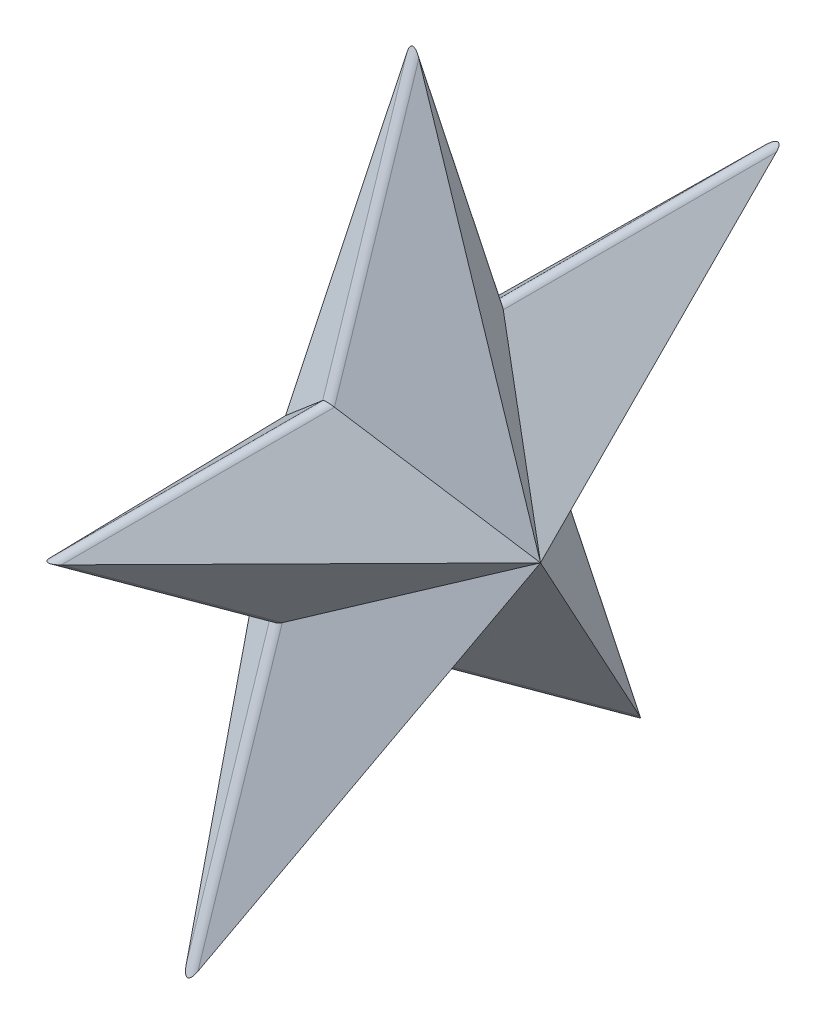
ISO-10303-21;
HEADER;
FILE_DESCRIPTION(('STEP AP214'),'2;1');
FILE_NAME('part.step','',(''),(''),'','','');
FILE_SCHEMA(('AUTOMOTIVE_DESIGN { 1 0 10303 214 1 1 1 1 }'));
ENDSEC;
DATA;
#1=APPLICATION_CONTEXT('core data for automotive mechanical design processes');
#2=APPLICATION_PROTOCOL_DEFINITION('international standard','automotive_design',2000,#1);
#3=PRODUCT_CONTEXT('',#1,'mechanical');
#4=PRODUCT('Part','Part','',(#3));
#5=PRODUCT_RELATED_PRODUCT_CATEGORY('part','',(#4));
#6=PRODUCT_DEFINITION_FORMATION('','',#4);
#7=PRODUCT_DEFINITION_CONTEXT('part definition',#1,'design');
#8=PRODUCT_DEFINITION('design','',#6,#7);
#9=PRODUCT_DEFINITION_SHAPE('','',#8);
#10=(LENGTH_UNIT() NAMED_UNIT(*) SI_UNIT(.MILLI.,.METRE.));
#11=(NAMED_UNIT(*) PLANE_ANGLE_UNIT() SI_UNIT($,.RADIAN.));
#12=(NAMED_UNIT(*) SI_UNIT($,.STERADIAN.) SOLID_ANGLE_UNIT());
#13=UNCERTAINTY_MEASURE_WITH_UNIT(LENGTH_MEASURE(1.E-05),#10,'distance_accuracy_value','');
#14=(GEOMETRIC_REPRESENTATION_CONTEXT(3) GLOBAL_UNCERTAINTY_ASSIGNED_CONTEXT((#13)) GLOBAL_UNIT_ASSIGNED_CONTEXT((#10,
#11,#12)) REPRESENTATION_CONTEXT('',''));
#15=CARTESIAN_POINT('',(0.,0.,0.));
#16=DIRECTION('',(0.,0.,1.));
#17=DIRECTION('',(1.,0.,0.));
#18=AXIS2_PLACEMENT_3D('',#15,#16,#17);
#19=CARTESIAN_POINT('',(-2.03166797890281,1.72125673326838,-1.25056621833506));
#20=DIRECTION('',(-0.690615588196487,0.585098915584263,-0.425099245261786));
#21=DIRECTION('',(-0.646413322714274,-0.762987428610388,0.));
#22=AXIS2_PLACEMENT_3D('',#19,#20,#21);
#23=PLANE('',#22);
#24=DIRECTION('',(0.307886935077417,-0.294005861268853,-0.90485699906018));
#25=VECTOR('',#24,1.);
#26=CARTESIAN_POINT('',(0.,13.1632262571573,11.1973090561716));
#27=LINE('',#26,#25);
#28=CARTESIAN_POINT('',(0.175416359401908,12.9957185393853,10.6817733108352));
#29=VERTEX_POINT('',#28);
#30=CARTESIAN_POINT('',(3.81,9.525,0.));
#31=VERTEX_POINT('',#30);
#32=EDGE_CURVE('E230',#29,#31,#27,.T.);
#33=ORIENTED_EDGE('',*,*,#32,.F.);
#34=DIRECTION('',(0.,-0.587785252292473,-0.809016994374947));
#35=VECTOR('',#34,1.);
#36=CARTESIAN_POINT('',(0.175416359401907,3.42632315465574,-2.48936948654689));
#37=LINE('',#36,#35);
#38=CARTESIAN_POINT('',(0.175416359401908,8.19930348333918,4.08007434461756));
#39=VERTEX_POINT('',#38);
#40=EDGE_CURVE('E320',#29,#39,#37,.T.);
#41=ORIENTED_EDGE('',*,*,#40,.T.);
#42=DIRECTION('',(0.646413322714274,0.235776081935052,-0.725644165831193));
#43=VECTOR('',#42,1.);
#44=CARTESIAN_POINT('',(0.,8.13532122852824,4.27699147692055));
#45=LINE('',#44,#43);
#46=EDGE_CURVE('E227',#39,#31,#45,.T.);
#47=ORIENTED_EDGE('',*,*,#46,.T.);
#48=EDGE_LOOP('',(#33,#41,#47));
#49=FACE_BOUND('',#48,.T.);
#50=ADVANCED_FACE('F64',(#49),#23,.F.);
#51=CARTESIAN_POINT('',(6.57461568743911,6.88502693307354,0.));
#52=DIRECTION('',(-0.690615588196486,-0.723222033223561,0.));
#53=DIRECTION('',(0.723222033223561,-0.690615588196486,0.));
#54=AXIS2_PLACEMENT_3D('',#51,#52,#53);
#55=PLANE('',#54);
#56=DIRECTION('',(0.646413322714274,-0.617269796240246,-0.448472758221742));
#57=VECTOR('',#56,1.);
#58=CARTESIAN_POINT('',(0.,13.1632262571573,2.64332610233051));
#59=LINE('',#58,#57);
#60=CARTESIAN_POINT('',(0.175416359401908,12.9957185393853,2.52162462160011));
#61=VERTEX_POINT('',#60);
#62=EDGE_CURVE('E296',#61,#31,#59,.T.);
#63=ORIENTED_EDGE('',*,*,#62,.F.);
#64=DIRECTION('',(0.,0.,1.));
#65=VECTOR('',#64,1.);
#66=CARTESIAN_POINT('',(0.175416359401906,12.9957185393853,11.1973090561716));
#67=LINE('',#66,#65);
#68=EDGE_CURVE('E318',#61,#29,#67,.T.);
#69=ORIENTED_EDGE('',*,*,#68,.T.);
#70=ORIENTED_EDGE('',*,*,#32,.T.);
#71=EDGE_LOOP('',(#63,#69,#70));
#72=FACE_BOUND('',#71,.T.);
#73=ADVANCED_FACE('F368',(#72),#55,.F.);
#74=CARTESIAN_POINT('',(3.28730784371956,1.06379516452447,3.27402486478361));
#75=DIRECTION('',(-0.690615588196486,-0.223487898972483,-0.687825027425498));
#76=DIRECTION('',(-0.705673844792395,0.,0.708536819633193));
#77=AXIS2_PLACEMENT_3D('',#74,#75,#76);
#78=PLANE('',#77);
#79=ORIENTED_EDGE('',*,*,#46,.F.);
#80=DIRECTION('',(0.,-0.951056516295154,0.309016994374948));
#81=VECTOR('',#80,1.);
#82=CARTESIAN_POINT('',(0.175416359401909,-0.0517627314804839,6.76100827273437));
#83=LINE('',#82,#81);
#84=CARTESIAN_POINT('',(0.175416359401907,0.438540898504769,6.60169896621767));
#85=VERTEX_POINT('',#84);
#86=EDGE_CURVE('E324',#39,#85,#83,.T.);
#87=ORIENTED_EDGE('',*,*,#86,.T.);
#88=DIRECTION('',(0.307886935077417,0.769717337693543,-0.559232380377423));
#89=VECTOR('',#88,1.);
#90=CARTESIAN_POINT('',(0.,0.,6.92031757925106));
#91=LINE('',#90,#89);
#92=EDGE_CURVE('E316',#85,#31,#91,.T.);
#93=ORIENTED_EDGE('',*,*,#92,.T.);
#94=EDGE_LOOP('',(#79,#87,#93));
#95=FACE_BOUND('',#94,.T.);
#96=ADVANCED_FACE('F358',(#95),#78,.F.);
#97=CARTESIAN_POINT('',(-2.03166797890281,1.72125673326839,1.25056621833506));
#98=DIRECTION('',(-0.690615588196486,0.585098915584264,0.425099245261786));
#99=DIRECTION('',(-0.646413322714274,-0.762987428610388,0.));
#100=AXIS2_PLACEMENT_3D('',#97,#98,#99);
#101=PLANE('',#100);
#102=ORIENTED_EDGE('',*,*,#92,.F.);
#103=DIRECTION('',(0.,0.587785252292473,-0.809016994374947));
#104=VECTOR('',#103,1.);
#105=CARTESIAN_POINT('',(0.175416359401907,3.42632315465575,2.48936948654689));
#106=LINE('',#105,#104);
#107=CARTESIAN_POINT('',(0.175416359401907,5.23495595455093,0.));
#108=VERTEX_POINT('',#107);
#109=EDGE_CURVE('E338',#85,#108,#106,.T.);
#110=ORIENTED_EDGE('',*,*,#109,.T.);
#111=DIRECTION('',(0.646413322714274,0.762987428610388,0.));
#112=VECTOR('',#111,1.);
#113=CARTESIAN_POINT('',(0.,5.02790502862901,0.));
#114=LINE('',#113,#112);
#115=EDGE_CURVE('E327',#108,#31,#114,.T.);
#116=ORIENTED_EDGE('',*,*,#115,.T.);
#117=EDGE_LOOP('',(#102,#110,#116));
#118=FACE_BOUND('',#117,.T.);
#119=ADVANCED_FACE('F360',(#118),#101,.F.);
#120=CARTESIAN_POINT('',(-2.03166797890281,1.72125673326838,-1.25056621833506));
#121=DIRECTION('',(-0.690615588196486,0.585098915584263,-0.425099245261786));
#122=DIRECTION('',(-0.646413322714274,-0.762987428610388,0.));
#123=AXIS2_PLACEMENT_3D('',#120,#121,#122);
#124=PLANE('',#123);
#125=ORIENTED_EDGE('',*,*,#115,.F.);
#126=DIRECTION('',(0.,-0.587785252292473,-0.809016994374948));
#127=VECTOR('',#126,1.);
#128=CARTESIAN_POINT('',(0.175416359401908,0.135516590366435,-7.01877614540256));
#129=LINE('',#128,#127);
#130=CARTESIAN_POINT('',(0.175416359401908,0.438540898504772,-6.60169896621766));
#131=VERTEX_POINT('',#130);
#132=EDGE_CURVE('E341',#108,#131,#129,.T.);
#133=ORIENTED_EDGE('',*,*,#132,.T.);
#134=DIRECTION('',(0.307886935077417,0.769717337693543,0.559232380377423));
#135=VECTOR('',#134,1.);
#136=CARTESIAN_POINT('',(0.,0.,-6.92031757925106));
#137=LINE('',#136,#135);
#138=EDGE_CURVE('E262',#131,#31,#137,.T.);
#139=ORIENTED_EDGE('',*,*,#138,.T.);
#140=EDGE_LOOP('',(#125,#133,#139));
#141=FACE_BOUND('',#140,.T.);
#142=ADVANCED_FACE('F345',(#141),#124,.F.);
#143=CARTESIAN_POINT('',(3.28730784371956,1.06379516452448,-3.27402486478362));
#144=DIRECTION('',(-0.690615588196486,-0.223487898972483,0.687825027425498));
#145=DIRECTION('',(0.705673844792395,0.,0.708536819633192));
#146=AXIS2_PLACEMENT_3D('',#143,#144,#145);
#147=PLANE('',#146);
#148=ORIENTED_EDGE('',*,*,#138,.F.);
#149=DIRECTION('',(0.,0.951056516295153,0.309016994374948));
#150=VECTOR('',#149,1.);
#151=CARTESIAN_POINT('',(0.175416359401909,1.98206757565158,-6.10017674715174));
#152=LINE('',#151,#150);
#153=CARTESIAN_POINT('',(0.175416359401908,8.19930348333919,-4.08007434461756));
#154=VERTEX_POINT('',#153);
#155=EDGE_CURVE('E87',#131,#154,#152,.T.);
#156=ORIENTED_EDGE('',*,*,#155,.T.);
#157=DIRECTION('',(0.646413322714274,0.235776081935052,0.725644165831193));
#158=VECTOR('',#157,1.);
#159=CARTESIAN_POINT('',(0.,8.13532122852825,-4.27699147692055));
#160=LINE('',#159,#158);
#161=EDGE_CURVE('E258',#154,#31,#160,.T.);
#162=ORIENTED_EDGE('',*,*,#161,.T.);
#163=EDGE_LOOP('',(#148,#156,#162));
#164=FACE_BOUND('',#163,.T.);
#165=ADVANCED_FACE('F346',(#164),#147,.F.);
#166=CARTESIAN_POINT('',(-2.03166797890281,1.72125673326838,1.25056621833506));
#167=DIRECTION('',(-0.690615588196486,0.585098915584263,0.425099245261786));
#168=DIRECTION('',(-0.646413322714274,-0.762987428610388,0.));
#169=AXIS2_PLACEMENT_3D('',#166,#167,#168);
#170=PLANE('',#169);
#171=ORIENTED_EDGE('',*,*,#161,.F.);
#172=DIRECTION('',(0.,0.587785252292473,-0.809016994374947));
#173=VECTOR('',#172,1.);
#174=CARTESIAN_POINT('',(0.175416359401908,13.201536733313,-10.9650577518613));
#175=LINE('',#174,#173);
#176=CARTESIAN_POINT('',(0.175416359401908,12.9957185393854,-10.6817733108352));
#177=VERTEX_POINT('',#176);
#178=EDGE_CURVE('E266',#154,#177,#175,.T.);
#179=ORIENTED_EDGE('',*,*,#178,.T.);
#180=DIRECTION('',(0.307886935077417,-0.294005861268853,0.90485699906018));
#181=VECTOR('',#180,1.);
#182=CARTESIAN_POINT('',(0.,13.1632262571573,-11.1973090561716));
#183=LINE('',#182,#181);
#184=EDGE_CURVE('E261',#177,#31,#183,.T.);
#185=ORIENTED_EDGE('',*,*,#184,.T.);
#186=EDGE_LOOP('',(#171,#179,#185));
#187=FACE_BOUND('',#186,.T.);
#188=ADVANCED_FACE('F471',(#187),#170,.F.);
#189=CARTESIAN_POINT('',(6.57461568743911,6.88502693307353,0.));
#190=DIRECTION('',(-0.690615588196486,-0.72322203322356,0.));
#191=DIRECTION('',(0.723222033223561,-0.690615588196486,0.));
#192=AXIS2_PLACEMENT_3D('',#189,#190,#191);
#193=PLANE('',#192);
#194=ORIENTED_EDGE('',*,*,#184,.F.);
#195=DIRECTION('',(0.,0.,1.));
#196=VECTOR('',#195,1.);
#197=CARTESIAN_POINT('',(0.175416359401905,12.9957185393853,0.));
#198=LINE('',#197,#196);
#199=CARTESIAN_POINT('',(0.175416359401908,12.9957185393854,-2.5216246216001));
#200=VERTEX_POINT('',#199);
#201=EDGE_CURVE('E449',#177,#200,#198,.T.);
#202=ORIENTED_EDGE('',*,*,#201,.T.);
#203=DIRECTION('',(0.646413322714274,-0.617269796240246,0.448472758221742));
#204=VECTOR('',#203,1.);
#205=CARTESIAN_POINT('',(0.,13.1632262571573,-2.64332610233051));
#206=LINE('',#205,#204);
#207=EDGE_CURVE('E457',#200,#31,#206,.T.);
#208=ORIENTED_EDGE('',*,*,#207,.T.);
#209=EDGE_LOOP('',(#194,#202,#208));
#210=FACE_BOUND('',#209,.T.);
#211=ADVANCED_FACE('F410',(#210),#193,.F.);
#212=CARTESIAN_POINT('',(3.28730784371956,1.06379516452448,-3.27402486478361));
#213=DIRECTION('',(-0.690615588196486,-0.223487898972483,0.687825027425497));
#214=DIRECTION('',(0.705673844792394,0.,0.708536819633193));
#215=AXIS2_PLACEMENT_3D('',#212,#213,#214);
#216=PLANE('',#215);
#217=ORIENTED_EDGE('',*,*,#207,.F.);
#218=DIRECTION('',(0.,0.951056516295153,0.309016994374948));
#219=VECTOR('',#218,1.);
#220=CARTESIAN_POINT('',(0.17541635940191,21.246784754205,0.159309306516702));
#221=LINE('',#220,#219);
#222=CARTESIAN_POINT('',(0.17541635940191,20.7564811242198,0.));
#223=VERTEX_POINT('',#222);
#224=EDGE_CURVE('E300',#200,#223,#221,.T.);
#225=ORIENTED_EDGE('',*,*,#224,.T.);
#226=DIRECTION('',(0.307886935077417,-0.95142295284938,0.));
#227=VECTOR('',#226,1.);
#228=CARTESIAN_POINT('',(0.,21.2985474856855,0.));
#229=LINE('',#228,#227);
#230=EDGE_CURVE('E301',#223,#31,#229,.T.);
#231=ORIENTED_EDGE('',*,*,#230,.T.);
#232=EDGE_LOOP('',(#217,#225,#231));
#233=FACE_BOUND('',#232,.T.);
#234=ADVANCED_FACE('F404',(#233),#216,.F.);
#235=CARTESIAN_POINT('',(3.28730784371955,1.06379516452447,3.27402486478361));
#236=DIRECTION('',(-0.690615588196486,-0.223487898972483,-0.687825027425497));
#237=DIRECTION('',(-0.705673844792394,0.,0.708536819633193));
#238=AXIS2_PLACEMENT_3D('',#235,#236,#237);
#239=PLANE('',#238);
#240=ORIENTED_EDGE('',*,*,#230,.F.);
#241=DIRECTION('',(0.,-0.951056516295154,0.309016994374947));
#242=VECTOR('',#241,1.);
#243=CARTESIAN_POINT('',(0.175416359401908,1.98206757565158,6.10017674715173));
#244=LINE('',#243,#242);
#245=EDGE_CURVE('E302',#223,#61,#244,.T.);
#246=ORIENTED_EDGE('',*,*,#245,.T.);
#247=ORIENTED_EDGE('',*,*,#62,.T.);
#248=EDGE_LOOP('',(#240,#246,#247));
#249=FACE_BOUND('',#248,.T.);
#250=ADVANCED_FACE('F400',(#249),#239,.F.);
#251=CARTESIAN_POINT('',(-6.57461568743911,6.88502693307353,0.));
#252=DIRECTION('',(0.690615588196487,-0.72322203322356,0.));
#253=DIRECTION('',(0.72322203322356,0.690615588196487,0.));
#254=AXIS2_PLACEMENT_3D('',#251,#252,#253);
#255=PLANE('',#254);
#256=DIRECTION('',(0.646413322714274,0.617269796240246,-0.448472758221742));
#257=VECTOR('',#256,1.);
#258=CARTESIAN_POINT('',(-3.81,9.525,0.));
#259=LINE('',#258,#257);
#260=CARTESIAN_POINT('',(-3.81,9.525,0.));
#261=VERTEX_POINT('',#260);
#262=CARTESIAN_POINT('',(-0.175416359401911,12.9957185393853,-2.5216246216001));
#263=VERTEX_POINT('',#262);
#264=EDGE_CURVE('E214',#261,#263,#259,.T.);
#265=ORIENTED_EDGE('',*,*,#264,.T.);
#266=DIRECTION('',(0.,0.,1.));
#267=VECTOR('',#266,1.);
#268=CARTESIAN_POINT('',(-0.17541635940191,12.9957185393853,0.));
#269=LINE('',#268,#267);
#270=CARTESIAN_POINT('',(-0.175416359401913,12.9957185393853,-10.6817733108352));
#271=VERTEX_POINT('',#270);
#272=EDGE_CURVE('E224',#263,#271,#269,.F.);
#273=ORIENTED_EDGE('',*,*,#272,.T.);
#274=DIRECTION('',(0.307886935077417,0.294005861268853,-0.90485699906018));
#275=VECTOR('',#274,1.);
#276=CARTESIAN_POINT('',(-3.81,9.525,0.));
#277=LINE('',#276,#275);
#278=EDGE_CURVE('E211',#261,#271,#277,.T.);
#279=ORIENTED_EDGE('',*,*,#278,.F.);
#280=EDGE_LOOP('',(#265,#273,#279));
#281=FACE_BOUND('',#280,.T.);
#282=ADVANCED_FACE('F223',(#281),#255,.F.);
#283=CARTESIAN_POINT('',(2.03166797890281,1.72125673326839,1.25056621833506));
#284=DIRECTION('',(-0.690615588196486,-0.585098915584264,-0.425099245261786));
#285=DIRECTION('',(0.646413322714275,-0.762987428610388,0.));
#286=AXIS2_PLACEMENT_3D('',#283,#284,#285);
#287=PLANE('',#286);
#288=ORIENTED_EDGE('',*,*,#278,.T.);
#289=DIRECTION('',(0.,0.587785252292473,-0.809016994374947));
#290=VECTOR('',#289,1.);
#291=CARTESIAN_POINT('',(-0.175416359401908,8.27083781889468,-4.17853291076905));
#292=LINE('',#291,#290);
#293=CARTESIAN_POINT('',(-0.175416359401908,8.19930348333919,-4.08007434461756));
#294=VERTEX_POINT('',#293);
#295=EDGE_CURVE('E12',#271,#294,#292,.F.);
#296=ORIENTED_EDGE('',*,*,#295,.T.);
#297=DIRECTION('',(0.646413322714275,-0.235776081935052,-0.725644165831192));
#298=VECTOR('',#297,1.);
#299=CARTESIAN_POINT('',(-3.81,9.525,0.));
#300=LINE('',#299,#298);
#301=EDGE_CURVE('E152',#261,#294,#300,.T.);
#302=ORIENTED_EDGE('',*,*,#301,.F.);
#303=EDGE_LOOP('',(#288,#296,#302));
#304=FACE_BOUND('',#303,.T.);
#305=ADVANCED_FACE('F226',(#304),#287,.T.);
#306=CARTESIAN_POINT('',(-3.28730784371956,1.06379516452448,-3.27402486478361));
#307=DIRECTION('',(-0.690615588196486,0.223487898972483,-0.687825027425497));
#308=DIRECTION('',(-0.705673844792394,0.,0.708536819633193));
#309=AXIS2_PLACEMENT_3D('',#306,#307,#308);
#310=PLANE('',#309);
#311=DIRECTION('',(0.307886935077417,0.95142295284938,0.));
#312=VECTOR('',#311,1.);
#313=CARTESIAN_POINT('',(-3.81,9.525,0.));
#314=LINE('',#313,#312);
#315=CARTESIAN_POINT('',(-0.175416359401907,20.7564811242198,0.));
#316=VERTEX_POINT('',#315);
#317=EDGE_CURVE('E203',#261,#316,#314,.T.);
#318=ORIENTED_EDGE('',*,*,#317,.T.);
#319=DIRECTION('',(0.,0.951056516295154,0.309016994374948));
#320=VECTOR('',#319,1.);
#321=CARTESIAN_POINT('',(-0.175416359401905,13.1114635256768,-2.48401679581381));
#322=LINE('',#321,#320);
#323=EDGE_CURVE('E217',#316,#263,#322,.F.);
#324=ORIENTED_EDGE('',*,*,#323,.T.);
#325=ORIENTED_EDGE('',*,*,#264,.F.);
#326=EDGE_LOOP('',(#318,#324,#325));
#327=FACE_BOUND('',#326,.T.);
#328=ADVANCED_FACE('F216',(#327),#310,.T.);
#329=CARTESIAN_POINT('',(-3.28730784371955,1.06379516452447,3.27402486478361));
#330=DIRECTION('',(0.690615588196487,-0.223487898972483,-0.687825027425497));
#331=DIRECTION('',(-0.705673844792394,0.,-0.708536819633193));
#332=AXIS2_PLACEMENT_3D('',#329,#330,#331);
#333=PLANE('',#332);
#334=DIRECTION('',(0.646413322714274,0.617269796240246,0.448472758221743));
#335=VECTOR('',#334,1.);
#336=CARTESIAN_POINT('',(-3.81,9.525,0.));
#337=LINE('',#336,#335);
#338=CARTESIAN_POINT('',(-0.175416359401909,12.9957185393853,2.5216246216001));
#339=VERTEX_POINT('',#338);
#340=EDGE_CURVE('E194',#261,#339,#337,.T.);
#341=ORIENTED_EDGE('',*,*,#340,.T.);
#342=DIRECTION('',(0.,-0.951056516295154,0.309016994374947));
#343=VECTOR('',#342,1.);
#344=CARTESIAN_POINT('',(-0.175416359401908,1.98206757565158,6.10017674715173));
#345=LINE('',#344,#343);
#346=EDGE_CURVE('E208',#339,#316,#345,.F.);
#347=ORIENTED_EDGE('',*,*,#346,.T.);
#348=ORIENTED_EDGE('',*,*,#317,.F.);
#349=EDGE_LOOP('',(#341,#347,#348));
#350=FACE_BOUND('',#349,.T.);
#351=ADVANCED_FACE('F207',(#350),#333,.F.);
#352=CARTESIAN_POINT('',(-6.57461568743911,6.88502693307354,0.));
#353=DIRECTION('',(-0.690615588196486,0.723222033223561,0.));
#354=DIRECTION('',(-0.723222033223561,-0.690615588196486,0.));
#355=AXIS2_PLACEMENT_3D('',#352,#353,#354);
#356=PLANE('',#355);
#357=DIRECTION('',(0.307886935077417,0.294005861268853,0.90485699906018));
#358=VECTOR('',#357,1.);
#359=CARTESIAN_POINT('',(-3.81,9.525,0.));
#360=LINE('',#359,#358);
#361=CARTESIAN_POINT('',(-0.175416359401908,12.9957185393853,10.6817733108352));
#362=VERTEX_POINT('',#361);
#363=EDGE_CURVE('E185',#261,#362,#360,.T.);
#364=ORIENTED_EDGE('',*,*,#363,.T.);
#365=DIRECTION('',(0.,0.,1.));
#366=VECTOR('',#365,1.);
#367=CARTESIAN_POINT('',(-0.175416359401908,12.9957185393853,2.64332610233051));
#368=LINE('',#367,#366);
#369=EDGE_CURVE('E200',#362,#339,#368,.F.);
#370=ORIENTED_EDGE('',*,*,#369,.T.);
#371=ORIENTED_EDGE('',*,*,#340,.F.);
#372=EDGE_LOOP('',(#364,#370,#371));
#373=FACE_BOUND('',#372,.T.);
#374=ADVANCED_FACE('F198',(#373),#356,.T.);
#375=CARTESIAN_POINT('',(2.03166797890281,1.72125673326838,-1.25056621833506));
#376=DIRECTION('',(0.690615588196487,0.585098915584263,-0.425099245261786));
#377=DIRECTION('',(-0.646413322714274,0.762987428610388,0.));
#378=AXIS2_PLACEMENT_3D('',#375,#376,#377);
#379=PLANE('',#378);
#380=DIRECTION('',(0.646413322714274,-0.235776081935052,0.725644165831193));
#381=VECTOR('',#380,1.);
#382=CARTESIAN_POINT('',(-3.81,9.525,0.));
#383=LINE('',#382,#381);
#384=CARTESIAN_POINT('',(-0.175416359401907,8.19930348333918,4.08007434461756));
#385=VERTEX_POINT('',#384);
#386=EDGE_CURVE('E176',#261,#385,#383,.T.);
#387=ORIENTED_EDGE('',*,*,#386,.T.);
#388=DIRECTION('',(0.,-0.587785252292473,-0.809016994374947));
#389=VECTOR('',#388,1.);
#390=CARTESIAN_POINT('',(-0.175416359401906,3.42632315465574,-2.48936948654689));
#391=LINE('',#390,#389);
#392=EDGE_CURVE('E191',#385,#362,#391,.F.);
#393=ORIENTED_EDGE('',*,*,#392,.T.);
#394=ORIENTED_EDGE('',*,*,#363,.F.);
#395=EDGE_LOOP('',(#387,#393,#394));
#396=FACE_BOUND('',#395,.T.);
#397=ADVANCED_FACE('F189',(#396),#379,.F.);
#398=CARTESIAN_POINT('',(-3.28730784371956,1.06379516452447,3.27402486478361));
#399=DIRECTION('',(-0.690615588196486,0.223487898972483,0.687825027425497));
#400=DIRECTION('',(0.705673844792394,0.,0.708536819633193));
#401=AXIS2_PLACEMENT_3D('',#398,#399,#400);
#402=PLANE('',#401);
#403=DIRECTION('',(0.307886935077417,-0.769717337693543,0.559232380377423));
#404=VECTOR('',#403,1.);
#405=CARTESIAN_POINT('',(-3.81,9.525,0.));
#406=LINE('',#405,#404);
#407=CARTESIAN_POINT('',(-0.17541635940191,0.438540898504775,6.60169896621766));
#408=VERTEX_POINT('',#407);
#409=EDGE_CURVE('E167',#261,#408,#406,.T.);
#410=ORIENTED_EDGE('',*,*,#409,.T.);
#411=DIRECTION('',(0.,-0.951056516295154,0.309016994374948));
#412=VECTOR('',#411,1.);
#413=CARTESIAN_POINT('',(-0.175416359401907,8.08355849704776,4.11768217040385));
#414=LINE('',#413,#412);
#415=EDGE_CURVE('E182',#408,#385,#414,.F.);
#416=ORIENTED_EDGE('',*,*,#415,.T.);
#417=ORIENTED_EDGE('',*,*,#386,.F.);
#418=EDGE_LOOP('',(#410,#416,#417));
#419=FACE_BOUND('',#418,.T.);
#420=ADVANCED_FACE('F180',(#419),#402,.T.);
#421=CARTESIAN_POINT('',(2.03166797890281,1.72125673326839,1.25056621833506));
#422=DIRECTION('',(0.690615588196486,0.585098915584264,0.425099245261786));
#423=DIRECTION('',(-0.646413322714275,0.762987428610387,0.));
#424=AXIS2_PLACEMENT_3D('',#421,#422,#423);
#425=PLANE('',#424);
#426=DIRECTION('',(0.646413322714274,-0.762987428610388,0.));
#427=VECTOR('',#426,1.);
#428=CARTESIAN_POINT('',(-3.81,9.525,0.));
#429=LINE('',#428,#427);
#430=CARTESIAN_POINT('',(-0.175416359401907,5.23495595455093,0.));
#431=VERTEX_POINT('',#430);
#432=EDGE_CURVE('E158',#261,#431,#429,.T.);
#433=ORIENTED_EDGE('',*,*,#432,.T.);
#434=DIRECTION('',(0.,0.587785252292473,-0.809016994374947));
#435=VECTOR('',#434,1.);
#436=CARTESIAN_POINT('',(-0.175416359401908,3.42632315465575,2.48936948654689));
#437=LINE('',#436,#435);
#438=EDGE_CURVE('E173',#431,#408,#437,.F.);
#439=ORIENTED_EDGE('',*,*,#438,.T.);
#440=ORIENTED_EDGE('',*,*,#409,.F.);
#441=EDGE_LOOP('',(#433,#439,#440));
#442=FACE_BOUND('',#441,.T.);
#443=ADVANCED_FACE('F171',(#442),#425,.F.);
#444=CARTESIAN_POINT('',(2.03166797890281,1.72125673326839,-1.25056621833506));
#445=DIRECTION('',(-0.690615588196486,-0.585098915584264,0.425099245261786));
#446=DIRECTION('',(0.646413322714274,-0.762987428610388,0.));
#447=AXIS2_PLACEMENT_3D('',#444,#445,#446);
#448=PLANE('',#447);
#449=DIRECTION('',(0.307886935077417,-0.769717337693543,-0.559232380377423));
#450=VECTOR('',#449,1.);
#451=CARTESIAN_POINT('',(-3.81,9.525,0.));
#452=LINE('',#451,#450);
#453=CARTESIAN_POINT('',(-0.175416359401905,0.438540898504763,-6.60169896621767));
#454=VERTEX_POINT('',#453);
#455=EDGE_CURVE('E149',#261,#454,#452,.T.);
#456=ORIENTED_EDGE('',*,*,#455,.T.);
#457=DIRECTION('',(0.,-0.587785252292473,-0.809016994374947));
#458=VECTOR('',#457,1.);
#459=CARTESIAN_POINT('',(-0.175416359401907,5.16342161899544,-0.0984585661514935));
#460=LINE('',#459,#458);
#461=EDGE_CURVE('E164',#454,#431,#460,.F.);
#462=ORIENTED_EDGE('',*,*,#461,.T.);
#463=ORIENTED_EDGE('',*,*,#432,.F.);
#464=EDGE_LOOP('',(#456,#462,#463));
#465=FACE_BOUND('',#464,.T.);
#466=ADVANCED_FACE('F162',(#465),#448,.T.);
#467=CARTESIAN_POINT('',(-3.28730784371955,1.06379516452448,-3.27402486478362));
#468=DIRECTION('',(0.690615588196486,-0.223487898972483,0.687825027425498));
#469=DIRECTION('',(0.705673844792395,0.,-0.708536819633192));
#470=AXIS2_PLACEMENT_3D('',#467,#468,#469);
#471=PLANE('',#470);
#472=ORIENTED_EDGE('',*,*,#301,.T.);
#473=DIRECTION('',(0.,0.951056516295154,0.309016994374948));
#474=VECTOR('',#473,1.);
#475=CARTESIAN_POINT('',(-0.175416359401904,1.98206757565158,-6.10017674715174));
#476=LINE('',#475,#474);
#477=EDGE_CURVE('E155',#294,#454,#476,.F.);
#478=ORIENTED_EDGE('',*,*,#477,.T.);
#479=ORIENTED_EDGE('',*,*,#455,.F.);
#480=EDGE_LOOP('',(#472,#478,#479));
#481=FACE_BOUND('',#480,.T.);
#482=ADVANCED_FACE('F151',(#481),#471,.F.);
#483=CARTESIAN_POINT('',(0.,12.8120201429466,0.));
#484=DIRECTION('',(0.,0.,1.));
#485=DIRECTION('',(0.,-1.,0.));
#486=AXIS2_PLACEMENT_3D('',#483,#484,#485);
#487=CYLINDRICAL_SURFACE('',#486,0.254);
#488=ORIENTED_EDGE('',*,*,#201,.F.);
#489=CARTESIAN_POINT('',(0.,12.8120201429466,-10.1164077803101));
#490=DIRECTION('',(0.,0.951056516295154,0.309016994374947));
#491=DIRECTION('',(0.,-0.309016994374948,0.951056516295153));
#492=AXIS2_PLACEMENT_3D('',#489,#490,#491);
#493=ELLIPSE('',#492,0.821961266284946,0.254);
#494=EDGE_CURVE('E73',#177,#271,#493,.T.);
#495=ORIENTED_EDGE('',*,*,#494,.T.);
#496=ORIENTED_EDGE('',*,*,#272,.F.);
#497=CARTESIAN_POINT('',(0.,12.8120201429466,-2.38815992426094));
#498=DIRECTION('',(0.,-0.587785252292473,-0.809016994374947));
#499=DIRECTION('',(0.,-0.809016994374948,0.587785252292473));
#500=AXIS2_PLACEMENT_3D('',#497,#498,#499);
#501=ELLIPSE('',#500,0.313961266284947,0.254);
#502=EDGE_CURVE('E221',#200,#263,#501,.F.);
#503=ORIENTED_EDGE('',*,*,#502,.F.);
#504=EDGE_LOOP('',(#488,#495,#496,#503));
#505=FACE_BOUND('',#504,.T.);
#506=ADVANCED_FACE('F382',(#505),#487,.T.);
#507=CARTESIAN_POINT('',(0.,1.92530164931257,-5.92546919018566));
#508=DIRECTION('',(0.,-0.951056516295153,-0.309016994374948));
#509=DIRECTION('',(0.,0.309016994374948,-0.951056516295154));
#510=AXIS2_PLACEMENT_3D('',#507,#508,#509);
#511=CYLINDRICAL_SURFACE('',#510,0.254);
#512=ORIENTED_EDGE('',*,*,#323,.F.);
#513=CARTESIAN_POINT('',(0.,20.1620206259862,0.));
#514=DIRECTION('',(0.,0.,-1.));
#515=DIRECTION('',(0.,-1.,0.));
#516=AXIS2_PLACEMENT_3D('',#513,#514,#515);
#517=ELLIPSE('',#516,0.821961266284946,0.254);
#518=EDGE_CURVE('E317',#316,#223,#517,.T.);
#519=ORIENTED_EDGE('',*,*,#518,.T.);
#520=ORIENTED_EDGE('',*,*,#224,.F.);
#521=ORIENTED_EDGE('',*,*,#502,.T.);
#522=EDGE_LOOP('',(#512,#519,#520,#521));
#523=FACE_BOUND('',#522,.T.);
#524=ADVANCED_FACE('F416',(#523),#511,.T.);
#525=CARTESIAN_POINT('',(0.,3.57493827921415,2.59734469484338));
#526=DIRECTION('',(0.,-0.587785252292473,0.809016994374947));
#527=DIRECTION('',(0.,-0.809016994374947,-0.587785252292473));
#528=AXIS2_PLACEMENT_3D('',#525,#526,#527);
#529=CYLINDRICAL_SURFACE('',#528,0.254);
#530=ORIENTED_EDGE('',*,*,#494,.F.);
#531=ORIENTED_EDGE('',*,*,#178,.F.);
#532=CARTESIAN_POINT('',(0.,8.26947002709995,-3.86412392802457));
#533=DIRECTION('',(0.,0.951056516295154,-0.309016994374947));
#534=DIRECTION('',(0.,0.309016994374947,0.951056516295154));
#535=AXIS2_PLACEMENT_3D('',#532,#533,#534);
#536=ELLIPSE('',#535,0.313961266284947,0.254);
#537=EDGE_CURVE('E68',#294,#154,#536,.F.);
#538=ORIENTED_EDGE('',*,*,#537,.F.);
#539=ORIENTED_EDGE('',*,*,#295,.F.);
#540=EDGE_LOOP('',(#530,#531,#538,#539));
#541=FACE_BOUND('',#540,.T.);
#542=ADVANCED_FACE('F66',(#541),#529,.T.);
#543=CARTESIAN_POINT('',(0.,1.92530164931257,-5.92546919018566));
#544=DIRECTION('',(0.,0.951056516295153,0.309016994374948));
#545=DIRECTION('',(0.,-0.309016994374948,0.951056516295154));
#546=AXIS2_PLACEMENT_3D('',#543,#544,#545);
#547=CYLINDRICAL_SURFACE('',#546,0.254);
#548=ORIENTED_EDGE('',*,*,#537,.T.);
#549=ORIENTED_EDGE('',*,*,#155,.F.);
#550=CARTESIAN_POINT('',(0.,0.919469544060361,-6.25228385228551));
#551=DIRECTION('',(0.,0.587785252292473,-0.809016994374947));
#552=DIRECTION('',(0.,0.809016994374947,0.587785252292473));
#553=AXIS2_PLACEMENT_3D('',#550,#551,#552);
#554=ELLIPSE('',#553,0.821961266284947,0.254);
#555=EDGE_CURVE('E282',#454,#131,#554,.F.);
#556=ORIENTED_EDGE('',*,*,#555,.F.);
#557=ORIENTED_EDGE('',*,*,#477,.F.);
#558=EDGE_LOOP('',(#548,#549,#556,#557));
#559=FACE_BOUND('',#558,.T.);
#560=ADVANCED_FACE('F347',(#559),#547,.T.);
#561=CARTESIAN_POINT('',(0.,3.57493827921415,-2.59734469484338));
#562=DIRECTION('',(0.,0.587785252292473,0.809016994374947));
#563=DIRECTION('',(0.,-0.809016994374948,0.587785252292473));
#564=AXIS2_PLACEMENT_3D('',#561,#562,#563);
#565=CYLINDRICAL_SURFACE('',#564,0.254);
#566=ORIENTED_EDGE('',*,*,#555,.T.);
#567=ORIENTED_EDGE('',*,*,#132,.F.);
#568=CARTESIAN_POINT('',(0.,5.46201965990697,0.));
#569=DIRECTION('',(0.,0.,-1.));
#570=DIRECTION('',(0.,1.,0.));
#571=AXIS2_PLACEMENT_3D('',#568,#569,#570);
#572=ELLIPSE('',#571,0.313961266284947,0.254);
#573=EDGE_CURVE('E280',#431,#108,#572,.F.);
#574=ORIENTED_EDGE('',*,*,#573,.F.);
#575=ORIENTED_EDGE('',*,*,#461,.F.);
#576=EDGE_LOOP('',(#566,#567,#574,#575));
#577=FACE_BOUND('',#576,.T.);
#578=ADVANCED_FACE('F348',(#577),#565,.T.);
#579=CARTESIAN_POINT('',(0.,3.57493827921415,2.59734469484338));
#580=DIRECTION('',(0.,0.587785252292473,-0.809016994374947));
#581=DIRECTION('',(0.,0.809016994374947,0.587785252292473));
#582=AXIS2_PLACEMENT_3D('',#579,#580,#581);
#583=CYLINDRICAL_SURFACE('',#582,0.254);
#584=ORIENTED_EDGE('',*,*,#573,.T.);
#585=ORIENTED_EDGE('',*,*,#109,.F.);
#586=CARTESIAN_POINT('',(0.,0.919469544060357,6.25228385228551));
#587=DIRECTION('',(0.,-0.587785252292473,-0.809016994374948));
#588=DIRECTION('',(0.,0.809016994374947,-0.587785252292473));
#589=AXIS2_PLACEMENT_3D('',#586,#587,#588);
#590=ELLIPSE('',#589,0.821961266284947,0.254);
#591=EDGE_CURVE('E277',#408,#85,#590,.F.);
#592=ORIENTED_EDGE('',*,*,#591,.F.);
#593=ORIENTED_EDGE('',*,*,#438,.F.);
#594=EDGE_LOOP('',(#584,#585,#592,#593));
#595=FACE_BOUND('',#594,.T.);
#596=ADVANCED_FACE('F351',(#595),#583,.T.);
#597=CARTESIAN_POINT('',(0.,1.92530164931257,5.92546919018566));
#598=DIRECTION('',(0.,0.951056516295153,-0.309016994374948));
#599=DIRECTION('',(0.,0.309016994374948,0.951056516295154));
#600=AXIS2_PLACEMENT_3D('',#597,#598,#599);
#601=CYLINDRICAL_SURFACE('',#600,0.254);
#602=ORIENTED_EDGE('',*,*,#591,.T.);
#603=ORIENTED_EDGE('',*,*,#86,.F.);
#604=CARTESIAN_POINT('',(0.,8.26947002709995,3.86412392802457));
#605=DIRECTION('',(0.,-0.951056516295154,-0.309016994374947));
#606=DIRECTION('',(0.,0.309016994374947,-0.951056516295154));
#607=AXIS2_PLACEMENT_3D('',#604,#605,#606);
#608=ELLIPSE('',#607,0.313961266284947,0.254);
#609=EDGE_CURVE('E274',#385,#39,#608,.F.);
#610=ORIENTED_EDGE('',*,*,#609,.F.);
#611=ORIENTED_EDGE('',*,*,#415,.F.);
#612=EDGE_LOOP('',(#602,#603,#610,#611));
#613=FACE_BOUND('',#612,.T.);
#614=ADVANCED_FACE('F354',(#613),#601,.T.);
#615=CARTESIAN_POINT('',(0.,3.57493827921415,-2.59734469484338));
#616=DIRECTION('',(0.,-0.587785252292473,-0.809016994374947));
#617=DIRECTION('',(0.,0.809016994374947,-0.587785252292473));
#618=AXIS2_PLACEMENT_3D('',#615,#616,#617);
#619=CYLINDRICAL_SURFACE('',#618,0.254);
#620=ORIENTED_EDGE('',*,*,#609,.T.);
#621=ORIENTED_EDGE('',*,*,#40,.F.);
#622=CARTESIAN_POINT('',(0.,12.8120201429466,10.1164077803101));
#623=DIRECTION('',(0.,-0.951056516295154,0.309016994374947));
#624=DIRECTION('',(0.,-0.309016994374947,-0.951056516295154));
#625=AXIS2_PLACEMENT_3D('',#622,#623,#624);
#626=ELLIPSE('',#625,0.821961266284946,0.254);
#627=EDGE_CURVE('E271',#362,#29,#626,.F.);
#628=ORIENTED_EDGE('',*,*,#627,.F.);
#629=ORIENTED_EDGE('',*,*,#392,.F.);
#630=EDGE_LOOP('',(#620,#621,#628,#629));
#631=FACE_BOUND('',#630,.T.);
#632=ADVANCED_FACE('F429',(#631),#619,.T.);
#633=CARTESIAN_POINT('',(0.,12.8120201429466,0.));
#634=DIRECTION('',(0.,0.,-1.));
#635=DIRECTION('',(-1.,0.,0.));
#636=AXIS2_PLACEMENT_3D('',#633,#634,#635);
#637=CYLINDRICAL_SURFACE('',#636,0.254);
#638=ORIENTED_EDGE('',*,*,#627,.T.);
#639=ORIENTED_EDGE('',*,*,#68,.F.);
#640=CARTESIAN_POINT('',(0.,12.8120201429466,2.38815992426094));
#641=DIRECTION('',(0.,-0.587785252292473,0.809016994374947));
#642=DIRECTION('',(0.,-0.809016994374947,-0.587785252292473));
#643=AXIS2_PLACEMENT_3D('',#640,#641,#642);
#644=ELLIPSE('',#643,0.313961266284947,0.254);
#645=EDGE_CURVE('E269',#339,#61,#644,.F.);
#646=ORIENTED_EDGE('',*,*,#645,.F.);
#647=ORIENTED_EDGE('',*,*,#369,.F.);
#648=EDGE_LOOP('',(#638,#639,#646,#647));
#649=FACE_BOUND('',#648,.T.);
#650=ADVANCED_FACE('F425',(#649),#637,.T.);
#651=CARTESIAN_POINT('',(0.,1.92530164931257,5.92546919018566));
#652=DIRECTION('',(0.,-0.951056516295154,0.309016994374947));
#653=DIRECTION('',(0.,-0.309016994374947,-0.951056516295154));
#654=AXIS2_PLACEMENT_3D('',#651,#652,#653);
#655=CYLINDRICAL_SURFACE('',#654,0.254);
#656=ORIENTED_EDGE('',*,*,#518,.F.);
#657=ORIENTED_EDGE('',*,*,#346,.F.);
#658=ORIENTED_EDGE('',*,*,#645,.T.);
#659=ORIENTED_EDGE('',*,*,#245,.F.);
#660=EDGE_LOOP('',(#656,#657,#658,#659));
#661=FACE_BOUND('',#660,.T.);
#662=ADVANCED_FACE('F422',(#661),#655,.T.);
#663=CLOSED_SHELL('',(#50,#73,#96,#119,#142,#165,#188,#211,#234,#250,#282,#305,#328,#351,#374,
#397,#420,#443,#466,#482,#506,#524,#542,#560,#578,#596,#614,#632,#650,#662));
#664=MANIFOLD_SOLID_BREP('B2',#663);
#665=ADVANCED_BREP_SHAPE_REPRESENTATION('',(#18,#664),#14);
#666=SHAPE_DEFINITION_REPRESENTATION(#9,#665);
ENDSEC;
END-ISO-10303-21;
